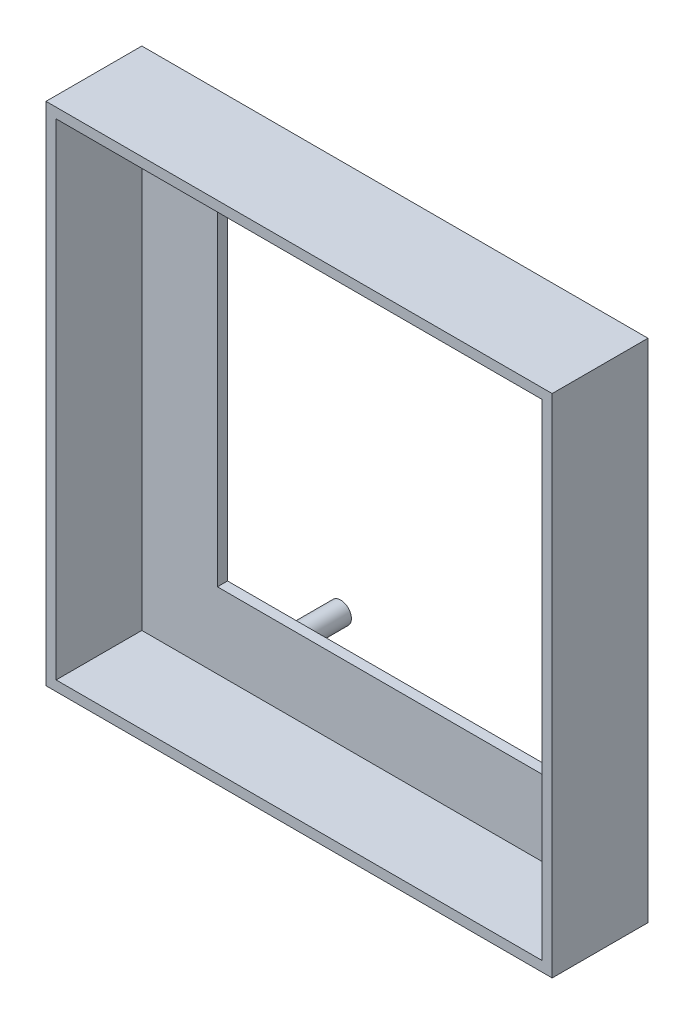
ISO-10303-21;
HEADER;
FILE_DESCRIPTION(('STEP AP214'),'2;1');
FILE_NAME('part.step','',(''),(''),'','','');
FILE_SCHEMA(('AUTOMOTIVE_DESIGN { 1 0 10303 214 1 1 1 1 }'));
ENDSEC;
DATA;
#1=APPLICATION_CONTEXT('core data for automotive mechanical design processes');
#2=APPLICATION_PROTOCOL_DEFINITION('international standard','automotive_design',2000,#1);
#3=PRODUCT_CONTEXT('',#1,'mechanical');
#4=PRODUCT('Part','Part','',(#3));
#5=PRODUCT_RELATED_PRODUCT_CATEGORY('part','',(#4));
#6=PRODUCT_DEFINITION_FORMATION('','',#4);
#7=PRODUCT_DEFINITION_CONTEXT('part definition',#1,'design');
#8=PRODUCT_DEFINITION('design','',#6,#7);
#9=PRODUCT_DEFINITION_SHAPE('','',#8);
#10=(LENGTH_UNIT() NAMED_UNIT(*) SI_UNIT(.MILLI.,.METRE.));
#11=(NAMED_UNIT(*) PLANE_ANGLE_UNIT() SI_UNIT($,.RADIAN.));
#12=(NAMED_UNIT(*) SI_UNIT($,.STERADIAN.) SOLID_ANGLE_UNIT());
#13=UNCERTAINTY_MEASURE_WITH_UNIT(LENGTH_MEASURE(1.E-05),#10,'distance_accuracy_value','');
#14=(GEOMETRIC_REPRESENTATION_CONTEXT(3) GLOBAL_UNCERTAINTY_ASSIGNED_CONTEXT((#13)) GLOBAL_UNIT_ASSIGNED_CONTEXT((#10,
#11,#12)) REPRESENTATION_CONTEXT('',''));
#15=CARTESIAN_POINT('',(0.,0.,0.));
#16=DIRECTION('',(0.,0.,1.));
#17=DIRECTION('',(1.,0.,0.));
#18=AXIS2_PLACEMENT_3D('',#15,#16,#17);
#19=CARTESIAN_POINT('',(0.,0.,3.));
#20=DIRECTION('',(0.,0.,1.));
#21=DIRECTION('',(1.,0.,0.));
#22=AXIS2_PLACEMENT_3D('',#19,#20,#21);
#23=PLANE('',#22);
#24=DIRECTION('',(0.,-1.,0.));
#25=VECTOR('',#24,1.);
#26=CARTESIAN_POINT('',(-72.,-72.,3.));
#27=LINE('',#26,#25);
#28=CARTESIAN_POINT('',(-72.,72.,3.));
#29=VERTEX_POINT('',#28);
#30=CARTESIAN_POINT('',(-72.,-72.,3.));
#31=VERTEX_POINT('',#30);
#32=EDGE_CURVE('E48',#29,#31,#27,.T.);
#33=ORIENTED_EDGE('',*,*,#32,.T.);
#34=DIRECTION('',(1.,0.,0.));
#35=VECTOR('',#34,1.);
#36=CARTESIAN_POINT('',(72.,-72.,3.));
#37=LINE('',#36,#35);
#38=CARTESIAN_POINT('',(72.,-72.,3.));
#39=VERTEX_POINT('',#38);
#40=EDGE_CURVE('E52',#31,#39,#37,.T.);
#41=ORIENTED_EDGE('',*,*,#40,.T.);
#42=DIRECTION('',(0.,1.,0.));
#43=VECTOR('',#42,1.);
#44=CARTESIAN_POINT('',(72.,-72.,3.));
#45=LINE('',#44,#43);
#46=CARTESIAN_POINT('',(72.,72.,3.));
#47=VERTEX_POINT('',#46);
#48=EDGE_CURVE('E152',#39,#47,#45,.T.);
#49=ORIENTED_EDGE('',*,*,#48,.T.);
#50=DIRECTION('',(-1.,0.,0.));
#51=VECTOR('',#50,1.);
#52=CARTESIAN_POINT('',(72.,72.,3.));
#53=LINE('',#52,#51);
#54=EDGE_CURVE('E131',#47,#29,#53,.T.);
#55=ORIENTED_EDGE('',*,*,#54,.T.);
#56=EDGE_LOOP('',(#33,#41,#49,#55));
#57=FACE_BOUND('',#56,.T.);
#58=DIRECTION('',(-1.,0.,0.));
#59=VECTOR('',#58,1.);
#60=CARTESIAN_POINT('',(49.6,49.6,3.));
#61=LINE('',#60,#59);
#62=CARTESIAN_POINT('',(49.6,49.6,3.));
#63=VERTEX_POINT('',#62);
#64=CARTESIAN_POINT('',(-49.6,49.6,3.));
#65=VERTEX_POINT('',#64);
#66=EDGE_CURVE('E174',#63,#65,#61,.T.);
#67=ORIENTED_EDGE('',*,*,#66,.F.);
#68=DIRECTION('',(0.,1.,0.));
#69=VECTOR('',#68,1.);
#70=CARTESIAN_POINT('',(49.6,-49.6,3.));
#71=LINE('',#70,#69);
#72=CARTESIAN_POINT('',(49.6,-49.6,3.));
#73=VERTEX_POINT('',#72);
#74=EDGE_CURVE('E172',#73,#63,#71,.T.);
#75=ORIENTED_EDGE('',*,*,#74,.F.);
#76=DIRECTION('',(1.,0.,0.));
#77=VECTOR('',#76,1.);
#78=CARTESIAN_POINT('',(49.6,-49.6,3.));
#79=LINE('',#78,#77);
#80=CARTESIAN_POINT('',(-49.6,-49.6,3.));
#81=VERTEX_POINT('',#80);
#82=EDGE_CURVE('E180',#81,#73,#79,.T.);
#83=ORIENTED_EDGE('',*,*,#82,.F.);
#84=DIRECTION('',(0.,-1.,0.));
#85=VECTOR('',#84,1.);
#86=CARTESIAN_POINT('',(-49.6,-49.6,3.));
#87=LINE('',#86,#85);
#88=EDGE_CURVE('E177',#65,#81,#87,.T.);
#89=ORIENTED_EDGE('',*,*,#88,.F.);
#90=EDGE_LOOP('',(#67,#75,#83,#89));
#91=FACE_BOUND('',#90,.T.);
#92=ADVANCED_FACE('F33',(#57,#91),#23,.T.);
#93=CARTESIAN_POINT('',(0.,0.,0.));
#94=DIRECTION('',(0.,0.,1.));
#95=DIRECTION('',(1.,0.,0.));
#96=AXIS2_PLACEMENT_3D('',#93,#94,#95);
#97=PLANE('',#96);
#98=CARTESIAN_POINT('',(-31.07,-55.9,0.));
#99=DIRECTION('',(0.,0.,1.));
#100=DIRECTION('',(1.,0.,0.));
#101=AXIS2_PLACEMENT_3D('',#98,#99,#100);
#102=CIRCLE('',#101,3.175);
#103=CARTESIAN_POINT('',(-27.895,-55.9,0.));
#104=VERTEX_POINT('',#103);
#105=EDGE_CURVE('E11',#104,#104,#102,.F.);
#106=ORIENTED_EDGE('',*,*,#105,.F.);
#107=EDGE_LOOP('',(#106));
#108=FACE_BOUND('',#107,.T.);
#109=DIRECTION('',(0.,-1.,0.));
#110=VECTOR('',#109,1.);
#111=CARTESIAN_POINT('',(-75.,-75.,0.));
#112=LINE('',#111,#110);
#113=CARTESIAN_POINT('',(-75.,75.,0.));
#114=VERTEX_POINT('',#113);
#115=CARTESIAN_POINT('',(-75.,-75.,0.));
#116=VERTEX_POINT('',#115);
#117=EDGE_CURVE('E202',#114,#116,#112,.T.);
#118=ORIENTED_EDGE('',*,*,#117,.F.);
#119=DIRECTION('',(-1.,0.,0.));
#120=VECTOR('',#119,1.);
#121=CARTESIAN_POINT('',(75.,75.,0.));
#122=LINE('',#121,#120);
#123=CARTESIAN_POINT('',(75.,75.,0.));
#124=VERTEX_POINT('',#123);
#125=EDGE_CURVE('E209',#124,#114,#122,.T.);
#126=ORIENTED_EDGE('',*,*,#125,.F.);
#127=DIRECTION('',(0.,1.,0.));
#128=VECTOR('',#127,1.);
#129=CARTESIAN_POINT('',(75.,-75.,0.));
#130=LINE('',#129,#128);
#131=CARTESIAN_POINT('',(75.,-75.,0.));
#132=VERTEX_POINT('',#131);
#133=EDGE_CURVE('E207',#132,#124,#130,.T.);
#134=ORIENTED_EDGE('',*,*,#133,.F.);
#135=DIRECTION('',(1.,0.,0.));
#136=VECTOR('',#135,1.);
#137=CARTESIAN_POINT('',(75.,-75.,0.));
#138=LINE('',#137,#136);
#139=EDGE_CURVE('E205',#116,#132,#138,.T.);
#140=ORIENTED_EDGE('',*,*,#139,.F.);
#141=EDGE_LOOP('',(#118,#126,#134,#140));
#142=FACE_BOUND('',#141,.T.);
#143=DIRECTION('',(0.,1.,0.));
#144=VECTOR('',#143,1.);
#145=CARTESIAN_POINT('',(49.6,-49.6,0.));
#146=LINE('',#145,#144);
#147=CARTESIAN_POINT('',(49.6,-49.6,0.));
#148=VERTEX_POINT('',#147);
#149=CARTESIAN_POINT('',(49.6,49.6,0.));
#150=VERTEX_POINT('',#149);
#151=EDGE_CURVE('E171',#148,#150,#146,.T.);
#152=ORIENTED_EDGE('',*,*,#151,.T.);
#153=DIRECTION('',(-1.,0.,0.));
#154=VECTOR('',#153,1.);
#155=CARTESIAN_POINT('',(49.6,49.6,0.));
#156=LINE('',#155,#154);
#157=CARTESIAN_POINT('',(-49.6,49.6,0.));
#158=VERTEX_POINT('',#157);
#159=EDGE_CURVE('E185',#150,#158,#156,.T.);
#160=ORIENTED_EDGE('',*,*,#159,.T.);
#161=DIRECTION('',(0.,-1.,0.));
#162=VECTOR('',#161,1.);
#163=CARTESIAN_POINT('',(-49.6,-49.6,0.));
#164=LINE('',#163,#162);
#165=CARTESIAN_POINT('',(-49.6,-49.6,0.));
#166=VERTEX_POINT('',#165);
#167=EDGE_CURVE('E188',#158,#166,#164,.T.);
#168=ORIENTED_EDGE('',*,*,#167,.T.);
#169=DIRECTION('',(1.,0.,0.));
#170=VECTOR('',#169,1.);
#171=CARTESIAN_POINT('',(49.6,-49.6,0.));
#172=LINE('',#171,#170);
#173=EDGE_CURVE('E175',#166,#148,#172,.T.);
#174=ORIENTED_EDGE('',*,*,#173,.T.);
#175=EDGE_LOOP('',(#152,#160,#168,#174));
#176=FACE_BOUND('',#175,.T.);
#177=ADVANCED_FACE('F228',(#108,#142,#176),#97,.F.);
#178=CARTESIAN_POINT('',(-75.,-75.,3.));
#179=DIRECTION('',(1.,0.,0.));
#180=DIRECTION('',(0.,0.,-1.));
#181=AXIS2_PLACEMENT_3D('',#178,#179,#180);
#182=PLANE('',#181);
#183=ORIENTED_EDGE('',*,*,#117,.T.);
#184=DIRECTION('',(0.,0.,-1.));
#185=VECTOR('',#184,1.);
#186=CARTESIAN_POINT('',(-75.,-75.,3.));
#187=LINE('',#186,#185);
#188=CARTESIAN_POINT('',(-75.,-75.,28.4));
#189=VERTEX_POINT('',#188);
#190=EDGE_CURVE('E41',#189,#116,#187,.T.);
#191=ORIENTED_EDGE('',*,*,#190,.F.);
#192=DIRECTION('',(0.,-1.,0.));
#193=VECTOR('',#192,1.);
#194=CARTESIAN_POINT('',(-75.,-75.,28.4));
#195=LINE('',#194,#193);
#196=CARTESIAN_POINT('',(-75.,75.,28.4));
#197=VERTEX_POINT('',#196);
#198=EDGE_CURVE('E136',#197,#189,#195,.T.);
#199=ORIENTED_EDGE('',*,*,#198,.F.);
#200=DIRECTION('',(0.,0.,-1.));
#201=VECTOR('',#200,1.);
#202=CARTESIAN_POINT('',(-75.,75.,3.));
#203=LINE('',#202,#201);
#204=EDGE_CURVE('E211',#197,#114,#203,.T.);
#205=ORIENTED_EDGE('',*,*,#204,.T.);
#206=EDGE_LOOP('',(#183,#191,#199,#205));
#207=FACE_BOUND('',#206,.T.);
#208=ADVANCED_FACE('F35',(#207),#182,.F.);
#209=CARTESIAN_POINT('',(75.,-75.,3.));
#210=DIRECTION('',(0.,1.,0.));
#211=DIRECTION('',(-1.,0.,0.));
#212=AXIS2_PLACEMENT_3D('',#209,#210,#211);
#213=PLANE('',#212);
#214=ORIENTED_EDGE('',*,*,#139,.T.);
#215=DIRECTION('',(0.,0.,-1.));
#216=VECTOR('',#215,1.);
#217=CARTESIAN_POINT('',(75.,-75.,3.));
#218=LINE('',#217,#216);
#219=CARTESIAN_POINT('',(75.,-75.,28.4));
#220=VERTEX_POINT('',#219);
#221=EDGE_CURVE('E217',#220,#132,#218,.T.);
#222=ORIENTED_EDGE('',*,*,#221,.F.);
#223=DIRECTION('',(1.,0.,0.));
#224=VECTOR('',#223,1.);
#225=CARTESIAN_POINT('',(75.,-75.,28.4));
#226=LINE('',#225,#224);
#227=EDGE_CURVE('E162',#189,#220,#226,.T.);
#228=ORIENTED_EDGE('',*,*,#227,.F.);
#229=ORIENTED_EDGE('',*,*,#190,.T.);
#230=EDGE_LOOP('',(#214,#222,#228,#229));
#231=FACE_BOUND('',#230,.T.);
#232=ADVANCED_FACE('F222',(#231),#213,.F.);
#233=CARTESIAN_POINT('',(75.,-75.,3.));
#234=DIRECTION('',(-1.,0.,0.));
#235=DIRECTION('',(0.,0.,1.));
#236=AXIS2_PLACEMENT_3D('',#233,#234,#235);
#237=PLANE('',#236);
#238=ORIENTED_EDGE('',*,*,#133,.T.);
#239=DIRECTION('',(0.,0.,-1.));
#240=VECTOR('',#239,1.);
#241=CARTESIAN_POINT('',(75.,75.,3.));
#242=LINE('',#241,#240);
#243=CARTESIAN_POINT('',(75.,75.,28.4));
#244=VERTEX_POINT('',#243);
#245=EDGE_CURVE('E214',#244,#124,#242,.T.);
#246=ORIENTED_EDGE('',*,*,#245,.F.);
#247=DIRECTION('',(0.,1.,0.));
#248=VECTOR('',#247,1.);
#249=CARTESIAN_POINT('',(75.,-75.,28.4));
#250=LINE('',#249,#248);
#251=EDGE_CURVE('E165',#220,#244,#250,.T.);
#252=ORIENTED_EDGE('',*,*,#251,.F.);
#253=ORIENTED_EDGE('',*,*,#221,.T.);
#254=EDGE_LOOP('',(#238,#246,#252,#253));
#255=FACE_BOUND('',#254,.T.);
#256=ADVANCED_FACE('F232',(#255),#237,.F.);
#257=CARTESIAN_POINT('',(75.,75.,3.));
#258=DIRECTION('',(0.,-1.,0.));
#259=DIRECTION('',(1.,0.,0.));
#260=AXIS2_PLACEMENT_3D('',#257,#258,#259);
#261=PLANE('',#260);
#262=ORIENTED_EDGE('',*,*,#125,.T.);
#263=ORIENTED_EDGE('',*,*,#204,.F.);
#264=DIRECTION('',(-1.,0.,0.));
#265=VECTOR('',#264,1.);
#266=CARTESIAN_POINT('',(75.,75.,28.4));
#267=LINE('',#266,#265);
#268=EDGE_CURVE('E168',#244,#197,#267,.T.);
#269=ORIENTED_EDGE('',*,*,#268,.F.);
#270=ORIENTED_EDGE('',*,*,#245,.T.);
#271=EDGE_LOOP('',(#262,#263,#269,#270));
#272=FACE_BOUND('',#271,.T.);
#273=ADVANCED_FACE('F236',(#272),#261,.F.);
#274=CARTESIAN_POINT('',(49.6,-49.6,3.));
#275=DIRECTION('',(-1.,0.,0.));
#276=DIRECTION('',(0.,0.,1.));
#277=AXIS2_PLACEMENT_3D('',#274,#275,#276);
#278=PLANE('',#277);
#279=ORIENTED_EDGE('',*,*,#151,.F.);
#280=DIRECTION('',(0.,0.,-1.));
#281=VECTOR('',#280,1.);
#282=CARTESIAN_POINT('',(49.6,-49.6,3.));
#283=LINE('',#282,#281);
#284=EDGE_CURVE('E182',#73,#148,#283,.T.);
#285=ORIENTED_EDGE('',*,*,#284,.F.);
#286=ORIENTED_EDGE('',*,*,#74,.T.);
#287=DIRECTION('',(0.,0.,-1.));
#288=VECTOR('',#287,1.);
#289=CARTESIAN_POINT('',(49.6,49.6,3.));
#290=LINE('',#289,#288);
#291=EDGE_CURVE('E199',#63,#150,#290,.T.);
#292=ORIENTED_EDGE('',*,*,#291,.T.);
#293=EDGE_LOOP('',(#279,#285,#286,#292));
#294=FACE_BOUND('',#293,.T.);
#295=ADVANCED_FACE('F259',(#294),#278,.T.);
#296=CARTESIAN_POINT('',(49.6,49.6,3.));
#297=DIRECTION('',(0.,-1.,0.));
#298=DIRECTION('',(1.,0.,0.));
#299=AXIS2_PLACEMENT_3D('',#296,#297,#298);
#300=PLANE('',#299);
#301=ORIENTED_EDGE('',*,*,#159,.F.);
#302=ORIENTED_EDGE('',*,*,#291,.F.);
#303=ORIENTED_EDGE('',*,*,#66,.T.);
#304=DIRECTION('',(0.,0.,-1.));
#305=VECTOR('',#304,1.);
#306=CARTESIAN_POINT('',(-49.6,49.6,3.));
#307=LINE('',#306,#305);
#308=EDGE_CURVE('E197',#65,#158,#307,.T.);
#309=ORIENTED_EDGE('',*,*,#308,.T.);
#310=EDGE_LOOP('',(#301,#302,#303,#309));
#311=FACE_BOUND('',#310,.T.);
#312=ADVANCED_FACE('F378',(#311),#300,.T.);
#313=CARTESIAN_POINT('',(-49.6,-49.6,3.));
#314=DIRECTION('',(1.,0.,0.));
#315=DIRECTION('',(0.,1.,0.));
#316=AXIS2_PLACEMENT_3D('',#313,#314,#315);
#317=PLANE('',#316);
#318=ORIENTED_EDGE('',*,*,#167,.F.);
#319=ORIENTED_EDGE('',*,*,#308,.F.);
#320=ORIENTED_EDGE('',*,*,#88,.T.);
#321=DIRECTION('',(0.,0.,-1.));
#322=VECTOR('',#321,1.);
#323=CARTESIAN_POINT('',(-49.6,-49.6,3.));
#324=LINE('',#323,#322);
#325=EDGE_CURVE('E195',#81,#166,#324,.T.);
#326=ORIENTED_EDGE('',*,*,#325,.T.);
#327=EDGE_LOOP('',(#318,#319,#320,#326));
#328=FACE_BOUND('',#327,.T.);
#329=ADVANCED_FACE('F246',(#328),#317,.T.);
#330=CARTESIAN_POINT('',(49.6,-49.6,3.));
#331=DIRECTION('',(0.,1.,0.));
#332=DIRECTION('',(-1.,0.,0.));
#333=AXIS2_PLACEMENT_3D('',#330,#331,#332);
#334=PLANE('',#333);
#335=ORIENTED_EDGE('',*,*,#173,.F.);
#336=ORIENTED_EDGE('',*,*,#325,.F.);
#337=ORIENTED_EDGE('',*,*,#82,.T.);
#338=ORIENTED_EDGE('',*,*,#284,.T.);
#339=EDGE_LOOP('',(#335,#336,#337,#338));
#340=FACE_BOUND('',#339,.T.);
#341=ADVANCED_FACE('F239',(#340),#334,.T.);
#342=CARTESIAN_POINT('',(0.,0.,28.4));
#343=DIRECTION('',(0.,0.,1.));
#344=DIRECTION('',(1.,0.,0.));
#345=AXIS2_PLACEMENT_3D('',#342,#343,#344);
#346=PLANE('',#345);
#347=ORIENTED_EDGE('',*,*,#198,.T.);
#348=ORIENTED_EDGE('',*,*,#227,.T.);
#349=ORIENTED_EDGE('',*,*,#251,.T.);
#350=ORIENTED_EDGE('',*,*,#268,.T.);
#351=EDGE_LOOP('',(#347,#348,#349,#350));
#352=FACE_BOUND('',#351,.T.);
#353=DIRECTION('',(1.,0.,0.));
#354=VECTOR('',#353,1.);
#355=CARTESIAN_POINT('',(72.,-72.,28.4));
#356=LINE('',#355,#354);
#357=CARTESIAN_POINT('',(-72.,-72.,28.4));
#358=VERTEX_POINT('',#357);
#359=CARTESIAN_POINT('',(72.,-72.,28.4));
#360=VERTEX_POINT('',#359);
#361=EDGE_CURVE('E130',#358,#360,#356,.T.);
#362=ORIENTED_EDGE('',*,*,#361,.F.);
#363=DIRECTION('',(0.,-1.,0.));
#364=VECTOR('',#363,1.);
#365=CARTESIAN_POINT('',(-72.,-72.,28.4));
#366=LINE('',#365,#364);
#367=CARTESIAN_POINT('',(-72.,72.,28.4));
#368=VERTEX_POINT('',#367);
#369=EDGE_CURVE('E121',#368,#358,#366,.T.);
#370=ORIENTED_EDGE('',*,*,#369,.F.);
#371=DIRECTION('',(-1.,0.,0.));
#372=VECTOR('',#371,1.);
#373=CARTESIAN_POINT('',(72.,72.,28.4));
#374=LINE('',#373,#372);
#375=CARTESIAN_POINT('',(72.,72.,28.4));
#376=VERTEX_POINT('',#375);
#377=EDGE_CURVE('E144',#376,#368,#374,.T.);
#378=ORIENTED_EDGE('',*,*,#377,.F.);
#379=DIRECTION('',(0.,1.,0.));
#380=VECTOR('',#379,1.);
#381=CARTESIAN_POINT('',(72.,-72.,28.4));
#382=LINE('',#381,#380);
#383=EDGE_CURVE('E142',#360,#376,#382,.T.);
#384=ORIENTED_EDGE('',*,*,#383,.F.);
#385=EDGE_LOOP('',(#362,#370,#378,#384));
#386=FACE_BOUND('',#385,.T.);
#387=ADVANCED_FACE('F140',(#352,#386),#346,.T.);
#388=CARTESIAN_POINT('',(-72.,-72.,28.4));
#389=DIRECTION('',(1.,0.,0.));
#390=DIRECTION('',(0.,0.,-1.));
#391=AXIS2_PLACEMENT_3D('',#388,#389,#390);
#392=PLANE('',#391);
#393=ORIENTED_EDGE('',*,*,#32,.F.);
#394=DIRECTION('',(0.,0.,-1.));
#395=VECTOR('',#394,1.);
#396=CARTESIAN_POINT('',(-72.,72.,28.4));
#397=LINE('',#396,#395);
#398=EDGE_CURVE('E126',#368,#29,#397,.T.);
#399=ORIENTED_EDGE('',*,*,#398,.F.);
#400=ORIENTED_EDGE('',*,*,#369,.T.);
#401=DIRECTION('',(0.,0.,-1.));
#402=VECTOR('',#401,1.);
#403=CARTESIAN_POINT('',(-72.,-72.,28.4));
#404=LINE('',#403,#402);
#405=EDGE_CURVE('E124',#358,#31,#404,.T.);
#406=ORIENTED_EDGE('',*,*,#405,.T.);
#407=EDGE_LOOP('',(#393,#399,#400,#406));
#408=FACE_BOUND('',#407,.T.);
#409=ADVANCED_FACE('F123',(#408),#392,.T.);
#410=CARTESIAN_POINT('',(72.,-72.,28.4));
#411=DIRECTION('',(0.,1.,0.));
#412=DIRECTION('',(0.,0.,1.));
#413=AXIS2_PLACEMENT_3D('',#410,#411,#412);
#414=PLANE('',#413);
#415=ORIENTED_EDGE('',*,*,#40,.F.);
#416=ORIENTED_EDGE('',*,*,#405,.F.);
#417=ORIENTED_EDGE('',*,*,#361,.T.);
#418=DIRECTION('',(0.,0.,-1.));
#419=VECTOR('',#418,1.);
#420=CARTESIAN_POINT('',(72.,-72.,28.4));
#421=LINE('',#420,#419);
#422=EDGE_CURVE('E137',#360,#39,#421,.T.);
#423=ORIENTED_EDGE('',*,*,#422,.T.);
#424=EDGE_LOOP('',(#415,#416,#417,#423));
#425=FACE_BOUND('',#424,.T.);
#426=ADVANCED_FACE('F134',(#425),#414,.T.);
#427=CARTESIAN_POINT('',(72.,-72.,28.4));
#428=DIRECTION('',(-1.,0.,0.));
#429=DIRECTION('',(0.,0.,1.));
#430=AXIS2_PLACEMENT_3D('',#427,#428,#429);
#431=PLANE('',#430);
#432=ORIENTED_EDGE('',*,*,#48,.F.);
#433=ORIENTED_EDGE('',*,*,#422,.F.);
#434=ORIENTED_EDGE('',*,*,#383,.T.);
#435=DIRECTION('',(0.,0.,-1.));
#436=VECTOR('',#435,1.);
#437=CARTESIAN_POINT('',(72.,72.,28.4));
#438=LINE('',#437,#436);
#439=EDGE_CURVE('E156',#376,#47,#438,.T.);
#440=ORIENTED_EDGE('',*,*,#439,.T.);
#441=EDGE_LOOP('',(#432,#433,#434,#440));
#442=FACE_BOUND('',#441,.T.);
#443=ADVANCED_FACE('F309',(#442),#431,.T.);
#444=CARTESIAN_POINT('',(72.,72.,28.4));
#445=DIRECTION('',(0.,-1.,0.));
#446=DIRECTION('',(0.,0.,-1.));
#447=AXIS2_PLACEMENT_3D('',#444,#445,#446);
#448=PLANE('',#447);
#449=ORIENTED_EDGE('',*,*,#54,.F.);
#450=ORIENTED_EDGE('',*,*,#439,.F.);
#451=ORIENTED_EDGE('',*,*,#377,.T.);
#452=ORIENTED_EDGE('',*,*,#398,.T.);
#453=EDGE_LOOP('',(#449,#450,#451,#452));
#454=FACE_BOUND('',#453,.T.);
#455=ADVANCED_FACE('F282',(#454),#448,.T.);
#456=CARTESIAN_POINT('',(-31.07,-55.9,-15.));
#457=DIRECTION('',(0.,0.,1.));
#458=DIRECTION('',(1.,0.,0.));
#459=AXIS2_PLACEMENT_3D('',#456,#457,#458);
#460=CYLINDRICAL_SURFACE('',#459,3.175);
#461=CARTESIAN_POINT('',(-31.07,-55.9,-15.));
#462=DIRECTION('',(0.,0.,-1.));
#463=DIRECTION('',(-1.,0.,0.));
#464=AXIS2_PLACEMENT_3D('',#461,#462,#463);
#465=CIRCLE('',#464,3.175);
#466=CARTESIAN_POINT('',(-34.245,-55.9,-15.));
#467=VERTEX_POINT('',#466);
#468=EDGE_CURVE('E150',#467,#467,#465,.T.);
#469=ORIENTED_EDGE('',*,*,#468,.F.);
#470=EDGE_LOOP('',(#469));
#471=FACE_BOUND('',#470,.T.);
#472=ORIENTED_EDGE('',*,*,#105,.T.);
#473=EDGE_LOOP('',(#472));
#474=FACE_BOUND('',#473,.T.);
#475=ADVANCED_FACE('F287',(#471,#474),#460,.T.);
#476=CARTESIAN_POINT('',(-31.07,-55.9,-15.));
#477=DIRECTION('',(0.,0.,-1.));
#478=DIRECTION('',(-1.,0.,0.));
#479=AXIS2_PLACEMENT_3D('',#476,#477,#478);
#480=PLANE('',#479);
#481=ORIENTED_EDGE('',*,*,#468,.T.);
#482=EDGE_LOOP('',(#481));
#483=FACE_BOUND('',#482,.T.);
#484=ADVANCED_FACE('F292',(#483),#480,.T.);
#485=CLOSED_SHELL('',(#92,#177,#208,#232,#256,#273,#295,#312,#329,#341,#387,#409,#426,#443,#455,
#475,#484));
#486=MANIFOLD_SOLID_BREP('B2',#485);
#487=ADVANCED_BREP_SHAPE_REPRESENTATION('',(#18,#486),#14);
#488=SHAPE_DEFINITION_REPRESENTATION(#9,#487);
ENDSEC;
END-ISO-10303-21;
